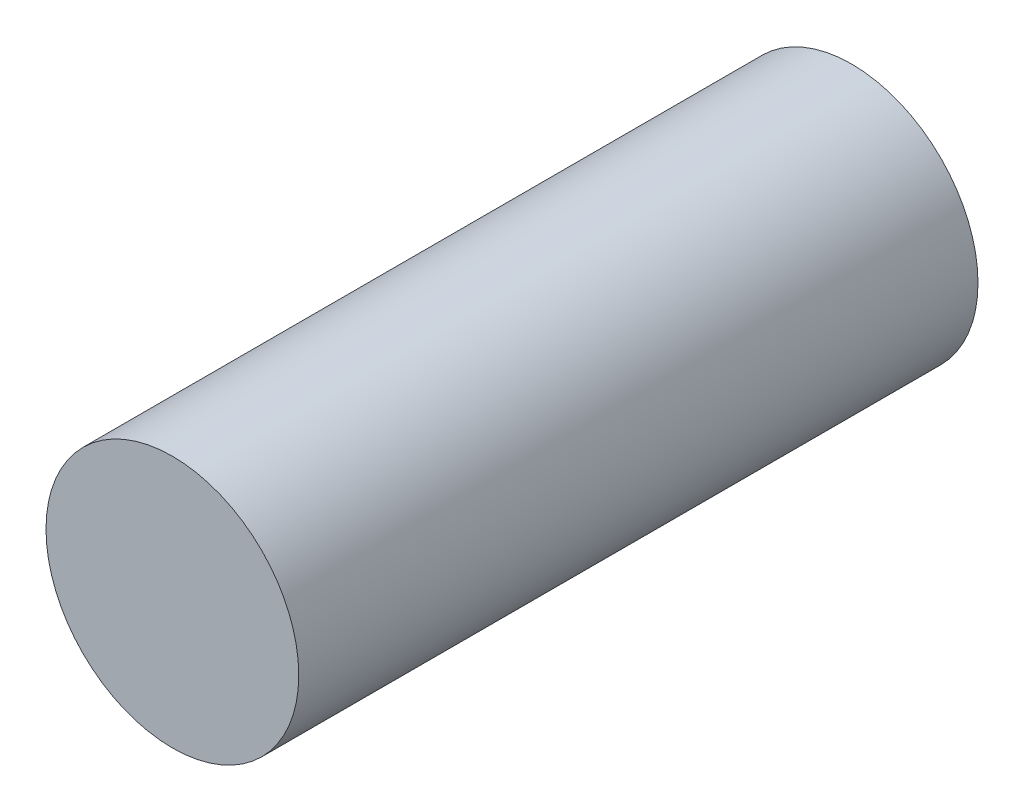
ISO-10303-21;
HEADER;
FILE_DESCRIPTION(('STEP AP214'),'2;1');
FILE_NAME('part.step','',(''),(''),'','','');
FILE_SCHEMA(('AUTOMOTIVE_DESIGN { 1 0 10303 214 1 1 1 1 }'));
ENDSEC;
DATA;
#1=APPLICATION_CONTEXT('core data for automotive mechanical design processes');
#2=APPLICATION_PROTOCOL_DEFINITION('international standard','automotive_design',2000,#1);
#3=PRODUCT_CONTEXT('',#1,'mechanical');
#4=PRODUCT('Part','Part','',(#3));
#5=PRODUCT_RELATED_PRODUCT_CATEGORY('part','',(#4));
#6=PRODUCT_DEFINITION_FORMATION('','',#4);
#7=PRODUCT_DEFINITION_CONTEXT('part definition',#1,'design');
#8=PRODUCT_DEFINITION('design','',#6,#7);
#9=PRODUCT_DEFINITION_SHAPE('','',#8);
#10=(LENGTH_UNIT() NAMED_UNIT(*) SI_UNIT(.MILLI.,.METRE.));
#11=(NAMED_UNIT(*) PLANE_ANGLE_UNIT() SI_UNIT($,.RADIAN.));
#12=(NAMED_UNIT(*) SI_UNIT($,.STERADIAN.) SOLID_ANGLE_UNIT());
#13=UNCERTAINTY_MEASURE_WITH_UNIT(LENGTH_MEASURE(1.E-05),#10,'distance_accuracy_value','');
#14=(GEOMETRIC_REPRESENTATION_CONTEXT(3) GLOBAL_UNCERTAINTY_ASSIGNED_CONTEXT((#13)) GLOBAL_UNIT_ASSIGNED_CONTEXT((#10,
#11,#12)) REPRESENTATION_CONTEXT('',''));
#15=CARTESIAN_POINT('',(0.,0.,0.));
#16=DIRECTION('',(0.,0.,1.));
#17=DIRECTION('',(1.,0.,0.));
#18=AXIS2_PLACEMENT_3D('',#15,#16,#17);
#19=CARTESIAN_POINT('',(0.,0.,21.5));
#20=DIRECTION('',(0.,0.,-1.));
#21=DIRECTION('',(-1.,0.,0.));
#22=AXIS2_PLACEMENT_3D('',#19,#20,#21);
#23=CYLINDRICAL_SURFACE('',#22,4.);
#24=CARTESIAN_POINT('',(0.,0.,0.));
#25=DIRECTION('',(0.,0.,1.));
#26=DIRECTION('',(1.,0.,0.));
#27=AXIS2_PLACEMENT_3D('',#24,#25,#26);
#28=CIRCLE('',#27,4.);
#29=CARTESIAN_POINT('',(4.,0.,0.));
#30=VERTEX_POINT('',#29);
#31=EDGE_CURVE('E203',#30,#30,#28,.T.);
#32=ORIENTED_EDGE('',*,*,#31,.T.);
#33=EDGE_LOOP('',(#32));
#34=FACE_BOUND('',#33,.T.);
#35=CARTESIAN_POINT('',(0.,0.,21.5));
#36=DIRECTION('',(0.,0.,1.));
#37=DIRECTION('',(1.,0.,0.));
#38=AXIS2_PLACEMENT_3D('',#35,#36,#37);
#39=CIRCLE('',#38,4.);
#40=CARTESIAN_POINT('',(4.,0.,21.5));
#41=VERTEX_POINT('',#40);
#42=EDGE_CURVE('E196',#41,#41,#39,.T.);
#43=ORIENTED_EDGE('',*,*,#42,.F.);
#44=EDGE_LOOP('',(#43));
#45=FACE_BOUND('',#44,.T.);
#46=CARTESIAN_POINT('',(0.,0.,3.5));
#47=DIRECTION('',(0.,0.,1.));
#48=DIRECTION('',(1.,0.,0.));
#49=AXIS2_PLACEMENT_3D('',#46,#47,#48);
#50=CIRCLE('',#49,4.);
#51=CARTESIAN_POINT('',(-3.99801948525833,0.125857838431891,3.5));
#52=VERTEX_POINT('',#51);
#53=CARTESIAN_POINT('',(-3.99801948525833,-0.125857838431891,3.5));
#54=VERTEX_POINT('',#53);
#55=EDGE_CURVE('E129',#52,#54,#50,.T.);
#56=ORIENTED_EDGE('',*,*,#55,.F.);
#57=CARTESIAN_POINT('',(-3.99801948525833,0.125857838431891,3.5));
#58=CARTESIAN_POINT('',(-3.99673263246779,0.166844856586794,3.49999874158195));
#59=CARTESIAN_POINT('',(-3.99480861869546,0.207790115634007,3.50168097928404));
#60=CARTESIAN_POINT('',(-3.98973164248578,0.289318343646819,3.50837213454654));
#61=CARTESIAN_POINT('',(-3.98657907122101,0.329901423727223,3.51337999358643));
#62=CARTESIAN_POINT('',(-3.97537675181758,0.450383770823694,3.53327623561093));
#63=CARTESIAN_POINT('',(-3.96557057131099,0.529371576192779,3.55303807402179));
#64=CARTESIAN_POINT('',(-3.94210773853126,0.68249628855339,3.60476070868729));
#65=CARTESIAN_POINT('',(-3.92845400626856,0.756636821901756,3.63671226032286));
#66=CARTESIAN_POINT('',(-3.89845839343059,0.898489251650175,3.71179018846561));
#67=CARTESIAN_POINT('',(-3.88211445800014,0.966196171025945,3.75492512176249));
#68=CARTESIAN_POINT('',(-3.84741144773351,1.09643266506494,3.85329614179824));
#69=CARTESIAN_POINT('',(-3.82899591607049,1.1586139581345,3.90897317671936));
#70=CARTESIAN_POINT('',(-3.79250952601473,1.27298115639352,4.02992866007465));
#71=CARTESIAN_POINT('',(-3.77443880534722,1.32516313989097,4.09521085794547));
#72=CARTESIAN_POINT('',(-3.73986941166915,1.41986429851514,4.23643505209315));
#73=CARTESIAN_POINT('',(-3.72345042036058,1.46196953427901,4.31267550606613));
#74=CARTESIAN_POINT('',(-3.69497435630068,1.5325210405181,4.47192911967735));
#75=CARTESIAN_POINT('',(-3.68291082213723,1.56098756499733,4.55493202098631));
#76=CARTESIAN_POINT('',(-3.66761484865019,1.59651410051497,4.69864230557345));
#77=CARTESIAN_POINT('',(-3.66280209029415,1.60748002729163,4.75824112310019));
#78=CARTESIAN_POINT('',(-3.65630861273086,1.62216676988515,4.87854230834086));
#79=CARTESIAN_POINT('',(-3.65463065564836,1.6258811964158,4.93924560172625));
#80=CARTESIAN_POINT('',(-3.65466637180599,1.62585783843189,5.));
#81=B_SPLINE_CURVE_WITH_KNOTS('',3,(#57,#58,#59,#60,#61,#62,#63,#64,#65,#66,#67,#68,#69,#70,#71,
#72,#73,#74,#75,#76,#77,#78,#79,#80),.UNSPECIFIED.,.F.,.F.,(4,2,2,2,2,2,2,2,2,2,2,4),(0.,
0.122940340296385,0.245841568340701,0.490591484052095,0.735156150425775,0.979908496723475,
1.2351955524967,1.49058252689656,1.75513392974146,2.01929123654609,2.20116658357156,
2.38320210850173),.UNSPECIFIED.);
#82=CARTESIAN_POINT('',(-3.65466637180599,1.62585783843189,5.));
#83=VERTEX_POINT('',#82);
#84=EDGE_CURVE('E115',#52,#83,#81,.T.);
#85=ORIENTED_EDGE('',*,*,#84,.T.);
#86=DIRECTION('',(0.,0.,-1.));
#87=VECTOR('',#86,1.);
#88=CARTESIAN_POINT('',(-3.65466637180599,1.62585783843189,21.5));
#89=LINE('',#88,#87);
#90=CARTESIAN_POINT('',(-3.65466637180599,1.62585783843189,17.));
#91=VERTEX_POINT('',#90);
#92=EDGE_CURVE('E136',#83,#91,#89,.F.);
#93=ORIENTED_EDGE('',*,*,#92,.T.);
#94=CARTESIAN_POINT('',(-3.65466637180599,1.62585783843189,17.));
#95=CARTESIAN_POINT('',(-3.65466132159849,1.62585962645453,17.0402553916515));
#96=CARTESIAN_POINT('',(-3.65538816248137,1.6242362834614,17.0804895296114));
#97=CARTESIAN_POINT('',(-3.65825466306148,1.61777368375385,17.1606329644286));
#98=CARTESIAN_POINT('',(-3.66039378487607,1.61293565138449,17.2005423791044));
#99=CARTESIAN_POINT('',(-3.66882631261045,1.59371234810209,17.3190168336295));
#100=CARTESIAN_POINT('',(-3.67713589290591,1.57461707203841,17.3967289920046));
#101=CARTESIAN_POINT('',(-3.69813393583026,1.52464009355371,17.5474677287338));
#102=CARTESIAN_POINT('',(-3.710817902965,1.49377048800311,17.6204990265234));
#103=CARTESIAN_POINT('',(-3.73920107805232,1.42122816989718,17.760415079444));
#104=CARTESIAN_POINT('',(-3.75490323330357,1.37954488361909,17.8272937312656));
#105=CARTESIAN_POINT('',(-3.78865976349797,1.28403604081626,17.9567810668551));
#106=CARTESIAN_POINT('',(-3.80679409676606,1.22969069311964,18.0189852814727));
#107=CARTESIAN_POINT('',(-3.84295930900446,1.11152114224106,18.1336888240056));
#108=CARTESIAN_POINT('',(-3.8609901571845,1.04769425588224,18.1861853952879));
#109=CARTESIAN_POINT('',(-3.89609029606495,0.90875992308956,18.2823934372229));
#110=CARTESIAN_POINT('',(-3.91307470008444,0.833263555866128,18.3255767491561));
#111=CARTESIAN_POINT('',(-3.94338881560745,0.675371940831859,18.3984189549824));
#112=CARTESIAN_POINT('',(-3.95672253126641,0.592984382016854,18.4280926903563));
#113=CARTESIAN_POINT('',(-3.97551479468959,0.446309375849039,18.4667758633965));
#114=CARTESIAN_POINT('',(-3.98212502867155,0.38304773540554,18.4791844907638));
#115=CARTESIAN_POINT('',(-3.99237602725836,0.255178722432629,18.4958128957836));
#116=CARTESIAN_POINT('',(-3.99601464868317,0.190570413040109,18.5000267662511));
#117=CARTESIAN_POINT('',(-3.99801948525833,0.125857838431891,18.5));
#118=B_SPLINE_CURVE_WITH_KNOTS('',3,(#94,#95,#96,#97,#98,#99,#100,#101,#102,#103,#104,#105,#106,
#107,#108,#109,#110,#111,#112,#113,#114,#115,#116,#117),.UNSPECIFIED.,.F.,.F.,(4,2,2,2,2,2,2,2,
2,2,2,4),(0.,0.120685770305709,0.241325602612527,0.481418988869123,0.721266366272314,
0.961349158592582,1.21395025369061,1.46662296893047,1.73115829823019,1.99540230630437,
2.18924436418444,2.3832261012647),.UNSPECIFIED.);
#119=CARTESIAN_POINT('',(-3.99801948525833,0.125857838431891,18.5));
#120=VERTEX_POINT('',#119);
#121=EDGE_CURVE('E54',#91,#120,#118,.T.);
#122=ORIENTED_EDGE('',*,*,#121,.T.);
#123=CARTESIAN_POINT('',(0.,0.,18.5));
#124=DIRECTION('',(0.,0.,1.));
#125=DIRECTION('',(1.,0.,0.));
#126=AXIS2_PLACEMENT_3D('',#123,#124,#125);
#127=CIRCLE('',#126,4.);
#128=CARTESIAN_POINT('',(-3.99801948525833,-0.125857838431891,18.5));
#129=VERTEX_POINT('',#128);
#130=EDGE_CURVE('E197',#120,#129,#127,.T.);
#131=ORIENTED_EDGE('',*,*,#130,.T.);
#132=CARTESIAN_POINT('',(-3.99801948525833,-0.125857838431891,18.5));
#133=CARTESIAN_POINT('',(-3.99673263246779,-0.166844856586793,18.500001258418));
#134=CARTESIAN_POINT('',(-3.99480861869546,-0.207790115634007,18.498319020716));
#135=CARTESIAN_POINT('',(-3.98973164248578,-0.289318343646818,18.4916278654535));
#136=CARTESIAN_POINT('',(-3.98657907122101,-0.329901423727222,18.4866200064136));
#137=CARTESIAN_POINT('',(-3.97537675181758,-0.450383770823693,18.4667237643891));
#138=CARTESIAN_POINT('',(-3.96557057131099,-0.529371576192779,18.4469619259782));
#139=CARTESIAN_POINT('',(-3.94210773853126,-0.682496288553389,18.3952392913127));
#140=CARTESIAN_POINT('',(-3.92845400626856,-0.756636821901754,18.3632877396771));
#141=CARTESIAN_POINT('',(-3.89845839343059,-0.898489251650173,18.2882098115344));
#142=CARTESIAN_POINT('',(-3.88211445800014,-0.966196171025943,18.2450748782375));
#143=CARTESIAN_POINT('',(-3.84741144773351,-1.09643266506494,18.1467038582018));
#144=CARTESIAN_POINT('',(-3.8289959160705,-1.1586139581345,18.0910268232806));
#145=CARTESIAN_POINT('',(-3.79250952601473,-1.27298115639352,17.9700713399254));
#146=CARTESIAN_POINT('',(-3.77443880534722,-1.32516313989097,17.9047891420545));
#147=CARTESIAN_POINT('',(-3.73986941166915,-1.41986429851514,17.7635649479069));
#148=CARTESIAN_POINT('',(-3.72345042036058,-1.46196953427901,17.6873244939339));
#149=CARTESIAN_POINT('',(-3.69497435630068,-1.5325210405181,17.5280708803226));
#150=CARTESIAN_POINT('',(-3.68291082213723,-1.56098756499733,17.4450679790137));
#151=CARTESIAN_POINT('',(-3.66761484865019,-1.59651410051497,17.3013576944265));
#152=CARTESIAN_POINT('',(-3.66280209029415,-1.60748002729163,17.2417588768998));
#153=CARTESIAN_POINT('',(-3.65630861273086,-1.62216676988515,17.1214576916591));
#154=CARTESIAN_POINT('',(-3.65463065564836,-1.6258811964158,17.0607543982737));
#155=CARTESIAN_POINT('',(-3.65466637180599,-1.62585783843189,17.));
#156=B_SPLINE_CURVE_WITH_KNOTS('',3,(#132,#133,#134,#135,#136,#137,#138,#139,#140,#141,#142,
#143,#144,#145,#146,#147,#148,#149,#150,#151,#152,#153,#154,#155),.UNSPECIFIED.,.F.,.F.,(4,2,2,
2,2,2,2,2,2,2,2,4),(0.,0.122940340296385,0.245841568340701,0.490591484052095,0.735156150425773,
0.979908496723473,1.2351955524967,1.49058252689655,1.75513392974146,2.01929123654609,
2.20116658357157,2.38320210850173),.UNSPECIFIED.);
#157=CARTESIAN_POINT('',(-3.65466637180599,-1.62585783843189,17.));
#158=VERTEX_POINT('',#157);
#159=EDGE_CURVE('E11',#129,#158,#156,.T.);
#160=ORIENTED_EDGE('',*,*,#159,.T.);
#161=DIRECTION('',(0.,0.,-1.));
#162=VECTOR('',#161,1.);
#163=CARTESIAN_POINT('',(-3.65466637180599,-1.62585783843189,21.5));
#164=LINE('',#163,#162);
#165=CARTESIAN_POINT('',(-3.65466637180599,-1.62585783843189,5.));
#166=VERTEX_POINT('',#165);
#167=EDGE_CURVE('E138',#158,#166,#164,.T.);
#168=ORIENTED_EDGE('',*,*,#167,.T.);
#169=CARTESIAN_POINT('',(-3.65466637180599,-1.62585783843189,5.));
#170=CARTESIAN_POINT('',(-3.65466132159849,-1.62585962645453,4.95974460834846));
#171=CARTESIAN_POINT('',(-3.65538816248137,-1.6242362834614,4.91951047038857));
#172=CARTESIAN_POINT('',(-3.65825466306148,-1.61777368375385,4.83936703557138));
#173=CARTESIAN_POINT('',(-3.66039378487607,-1.61293565138449,4.79945762089555));
#174=CARTESIAN_POINT('',(-3.66882631261045,-1.59371234810209,4.68098316637052));
#175=CARTESIAN_POINT('',(-3.67713589290591,-1.57461707203841,4.60327100799537));
#176=CARTESIAN_POINT('',(-3.69813393583026,-1.52464009355371,4.45253227126616));
#177=CARTESIAN_POINT('',(-3.710817902965,-1.49377048800311,4.37950097347657));
#178=CARTESIAN_POINT('',(-3.73920107805232,-1.42122816989718,4.23958492055598));
#179=CARTESIAN_POINT('',(-3.75490323330357,-1.37954488361909,4.1727062687344));
#180=CARTESIAN_POINT('',(-3.78865976349797,-1.28403604081626,4.04321893314489));
#181=CARTESIAN_POINT('',(-3.80679409676606,-1.22969069311964,3.9810147185273));
#182=CARTESIAN_POINT('',(-3.84295930900446,-1.11152114224106,3.86631117599441));
#183=CARTESIAN_POINT('',(-3.8609901571845,-1.04769425588224,3.81381460471209));
#184=CARTESIAN_POINT('',(-3.89609029606495,-0.908759923089559,3.71760656277707));
#185=CARTESIAN_POINT('',(-3.91307470008444,-0.833263555866127,3.67442325084387));
#186=CARTESIAN_POINT('',(-3.94338881560745,-0.675371940831858,3.60158104501757));
#187=CARTESIAN_POINT('',(-3.95672253126641,-0.592984382016852,3.57190730964374));
#188=CARTESIAN_POINT('',(-3.97551479468959,-0.446309375849037,3.53322413660347));
#189=CARTESIAN_POINT('',(-3.98212502867155,-0.383047735405539,3.52081550923622));
#190=CARTESIAN_POINT('',(-3.99237602725836,-0.255178722432628,3.50418710421639));
#191=CARTESIAN_POINT('',(-3.99601464868317,-0.190570413040109,3.49997323374889));
#192=CARTESIAN_POINT('',(-3.99801948525833,-0.125857838431891,3.5));
#193=B_SPLINE_CURVE_WITH_KNOTS('',3,(#169,#170,#171,#172,#173,#174,#175,#176,#177,#178,#179,
#180,#181,#182,#183,#184,#185,#186,#187,#188,#189,#190,#191,#192),.UNSPECIFIED.,.F.,.F.,(4,2,2,
2,2,2,2,2,2,2,2,4),(0.,0.120685770305705,0.241325602612527,0.481418988869124,0.721266366272311,
0.961349158592583,1.21395025369061,1.46662296893047,1.73115829823019,1.99540230630437,
2.18924436418444,2.3832261012647),.UNSPECIFIED.);
#194=EDGE_CURVE('E125',#166,#54,#193,.T.);
#195=ORIENTED_EDGE('',*,*,#194,.T.);
#196=EDGE_LOOP('',(#56,#85,#93,#122,#131,#160,#168,#195));
#197=FACE_BOUND('',#196,.T.);
#198=ADVANCED_FACE('F41',(#34,#45,#197),#23,.T.);
#199=CARTESIAN_POINT('',(0.,0.,21.5));
#200=DIRECTION('',(0.,0.,1.));
#201=DIRECTION('',(1.,0.,0.));
#202=AXIS2_PLACEMENT_3D('',#199,#200,#201);
#203=PLANE('',#202);
#204=ORIENTED_EDGE('',*,*,#42,.T.);
#205=EDGE_LOOP('',(#204));
#206=FACE_BOUND('',#205,.T.);
#207=ADVANCED_FACE('F233',(#206),#203,.T.);
#208=CARTESIAN_POINT('',(0.,0.,0.));
#209=DIRECTION('',(0.,0.,1.));
#210=DIRECTION('',(1.,0.,0.));
#211=AXIS2_PLACEMENT_3D('',#208,#209,#210);
#212=PLANE('',#211);
#213=ORIENTED_EDGE('',*,*,#31,.F.);
#214=EDGE_LOOP('',(#213));
#215=FACE_BOUND('',#214,.T.);
#216=ADVANCED_FACE('F224',(#215),#212,.F.);
#217=CARTESIAN_POINT('',(-5.25000004,-1.62585783843189,3.5));
#218=DIRECTION('',(0.,-1.,0.));
#219=DIRECTION('',(0.,0.,-1.));
#220=AXIS2_PLACEMENT_3D('',#217,#218,#219);
#221=PLANE('',#220);
#222=ORIENTED_EDGE('',*,*,#167,.F.);
#223=DIRECTION('',(1.,0.,0.));
#224=VECTOR('',#223,1.);
#225=CARTESIAN_POINT('',(-2.74999996,-1.62585783843189,17.));
#226=LINE('',#225,#224);
#227=CARTESIAN_POINT('',(-2.74999996,-1.62585783843189,17.));
#228=VERTEX_POINT('',#227);
#229=EDGE_CURVE('E179',#158,#228,#226,.T.);
#230=ORIENTED_EDGE('',*,*,#229,.T.);
#231=DIRECTION('',(0.,0.,1.));
#232=VECTOR('',#231,1.);
#233=CARTESIAN_POINT('',(-2.74999996,-1.62585783843189,3.5));
#234=LINE('',#233,#232);
#235=CARTESIAN_POINT('',(-2.74999996,-1.62585783843189,5.));
#236=VERTEX_POINT('',#235);
#237=EDGE_CURVE('E204',#236,#228,#234,.T.);
#238=ORIENTED_EDGE('',*,*,#237,.F.);
#239=DIRECTION('',(1.,0.,0.));
#240=VECTOR('',#239,1.);
#241=CARTESIAN_POINT('',(-5.25000004,-1.62585783843189,5.));
#242=LINE('',#241,#240);
#243=EDGE_CURVE('E150',#236,#166,#242,.F.);
#244=ORIENTED_EDGE('',*,*,#243,.T.);
#245=EDGE_LOOP('',(#222,#230,#238,#244));
#246=FACE_BOUND('',#245,.T.);
#247=ADVANCED_FACE('F219',(#246),#221,.F.);
#248=CARTESIAN_POINT('',(-5.25000004,1.62585783843189,3.5));
#249=DIRECTION('',(0.,1.,0.));
#250=DIRECTION('',(0.,0.,1.));
#251=AXIS2_PLACEMENT_3D('',#248,#249,#250);
#252=PLANE('',#251);
#253=DIRECTION('',(0.,0.,1.));
#254=VECTOR('',#253,1.);
#255=CARTESIAN_POINT('',(-2.74999996,1.62585783843189,3.5));
#256=LINE('',#255,#254);
#257=CARTESIAN_POINT('',(-2.74999996,1.62585783843189,5.));
#258=VERTEX_POINT('',#257);
#259=CARTESIAN_POINT('',(-2.74999996,1.62585783843189,17.));
#260=VERTEX_POINT('',#259);
#261=EDGE_CURVE('E192',#258,#260,#256,.T.);
#262=ORIENTED_EDGE('',*,*,#261,.T.);
#263=DIRECTION('',(-1.,0.,0.));
#264=VECTOR('',#263,1.);
#265=CARTESIAN_POINT('',(-3.65466637180599,1.62585783843189,17.));
#266=LINE('',#265,#264);
#267=EDGE_CURVE('E123',#260,#91,#266,.T.);
#268=ORIENTED_EDGE('',*,*,#267,.T.);
#269=ORIENTED_EDGE('',*,*,#92,.F.);
#270=DIRECTION('',(-1.,0.,0.));
#271=VECTOR('',#270,1.);
#272=CARTESIAN_POINT('',(-5.25000004,1.62585783843189,5.));
#273=LINE('',#272,#271);
#274=EDGE_CURVE('E117',#83,#258,#273,.F.);
#275=ORIENTED_EDGE('',*,*,#274,.T.);
#276=EDGE_LOOP('',(#262,#268,#269,#275));
#277=FACE_BOUND('',#276,.T.);
#278=ADVANCED_FACE('F195',(#277),#252,.F.);
#279=CARTESIAN_POINT('',(0.,0.,3.5));
#280=DIRECTION('',(0.,0.,1.));
#281=DIRECTION('',(1.,0.,0.));
#282=AXIS2_PLACEMENT_3D('',#279,#280,#281);
#283=PLANE('',#282);
#284=ORIENTED_EDGE('',*,*,#55,.T.);
#285=DIRECTION('',(1.,0.,0.));
#286=VECTOR('',#285,1.);
#287=CARTESIAN_POINT('',(0.,-0.125857838431891,3.5));
#288=LINE('',#287,#286);
#289=CARTESIAN_POINT('',(-2.74999996,-0.12585783843189,3.5));
#290=VERTEX_POINT('',#289);
#291=EDGE_CURVE('E134',#54,#290,#288,.T.);
#292=ORIENTED_EDGE('',*,*,#291,.T.);
#293=DIRECTION('',(0.,1.,0.));
#294=VECTOR('',#293,1.);
#295=CARTESIAN_POINT('',(-2.74999996,1.62585783843189,3.5));
#296=LINE('',#295,#294);
#297=CARTESIAN_POINT('',(-2.74999996,0.125857838431891,3.5));
#298=VERTEX_POINT('',#297);
#299=EDGE_CURVE('E132',#290,#298,#296,.T.);
#300=ORIENTED_EDGE('',*,*,#299,.T.);
#301=DIRECTION('',(-1.,0.,0.));
#302=VECTOR('',#301,1.);
#303=CARTESIAN_POINT('',(0.,0.125857838431891,3.5));
#304=LINE('',#303,#302);
#305=EDGE_CURVE('E116',#298,#52,#304,.T.);
#306=ORIENTED_EDGE('',*,*,#305,.T.);
#307=EDGE_LOOP('',(#284,#292,#300,#306));
#308=FACE_BOUND('',#307,.T.);
#309=ADVANCED_FACE('F130',(#308),#283,.T.);
#310=CARTESIAN_POINT('',(0.,0.,18.5));
#311=DIRECTION('',(0.,0.,1.));
#312=DIRECTION('',(1.,0.,0.));
#313=AXIS2_PLACEMENT_3D('',#310,#311,#312);
#314=PLANE('',#313);
#315=ORIENTED_EDGE('',*,*,#130,.F.);
#316=DIRECTION('',(-1.,0.,0.));
#317=VECTOR('',#316,1.);
#318=CARTESIAN_POINT('',(-2.74999996,0.125857838431891,18.5));
#319=LINE('',#318,#317);
#320=CARTESIAN_POINT('',(-2.74999996,0.125857838431891,18.5));
#321=VERTEX_POINT('',#320);
#322=EDGE_CURVE('E183',#120,#321,#319,.F.);
#323=ORIENTED_EDGE('',*,*,#322,.T.);
#324=DIRECTION('',(0.,1.,0.));
#325=VECTOR('',#324,1.);
#326=CARTESIAN_POINT('',(-2.74999996,1.62585783843189,18.5));
#327=LINE('',#326,#325);
#328=CARTESIAN_POINT('',(-2.74999996,-0.12585783843189,18.5));
#329=VERTEX_POINT('',#328);
#330=EDGE_CURVE('E209',#329,#321,#327,.T.);
#331=ORIENTED_EDGE('',*,*,#330,.F.);
#332=DIRECTION('',(1.,0.,0.));
#333=VECTOR('',#332,1.);
#334=CARTESIAN_POINT('',(-3.65466637180599,-0.125857838431891,18.5));
#335=LINE('',#334,#333);
#336=EDGE_CURVE('E187',#329,#129,#335,.F.);
#337=ORIENTED_EDGE('',*,*,#336,.T.);
#338=EDGE_LOOP('',(#315,#323,#331,#337));
#339=FACE_BOUND('',#338,.T.);
#340=ADVANCED_FACE('F220',(#339),#314,.F.);
#341=CARTESIAN_POINT('',(-2.74999996,1.62585783843189,3.5));
#342=DIRECTION('',(1.,0.,0.));
#343=DIRECTION('',(0.,1.,0.));
#344=AXIS2_PLACEMENT_3D('',#341,#342,#343);
#345=PLANE('',#344);
#346=ORIENTED_EDGE('',*,*,#330,.T.);
#347=CARTESIAN_POINT('',(-2.74999996,0.125857838431891,17.));
#348=DIRECTION('',(1.,0.,0.));
#349=DIRECTION('',(0.,1.,0.));
#350=AXIS2_PLACEMENT_3D('',#347,#348,#349);
#351=CIRCLE('',#350,1.5);
#352=EDGE_CURVE('E185',#321,#260,#351,.F.);
#353=ORIENTED_EDGE('',*,*,#352,.T.);
#354=ORIENTED_EDGE('',*,*,#261,.F.);
#355=CARTESIAN_POINT('',(-2.74999996,0.125857838431891,5.));
#356=DIRECTION('',(1.,0.,0.));
#357=DIRECTION('',(0.,1.,0.));
#358=AXIS2_PLACEMENT_3D('',#355,#356,#357);
#359=CIRCLE('',#358,1.5);
#360=EDGE_CURVE('E141',#258,#298,#359,.F.);
#361=ORIENTED_EDGE('',*,*,#360,.T.);
#362=ORIENTED_EDGE('',*,*,#299,.F.);
#363=CARTESIAN_POINT('',(-2.74999996,-0.125857838431891,5.));
#364=DIRECTION('',(1.,0.,0.));
#365=DIRECTION('',(0.,1.,0.));
#366=AXIS2_PLACEMENT_3D('',#363,#364,#365);
#367=CIRCLE('',#366,1.5);
#368=EDGE_CURVE('E144',#290,#236,#367,.F.);
#369=ORIENTED_EDGE('',*,*,#368,.T.);
#370=ORIENTED_EDGE('',*,*,#237,.T.);
#371=CARTESIAN_POINT('',(-2.74999996,-0.125857838431891,17.));
#372=DIRECTION('',(1.,0.,0.));
#373=DIRECTION('',(0.,1.,0.));
#374=AXIS2_PLACEMENT_3D('',#371,#372,#373);
#375=CIRCLE('',#374,1.5);
#376=EDGE_CURVE('E66',#228,#329,#375,.F.);
#377=ORIENTED_EDGE('',*,*,#376,.T.);
#378=EDGE_LOOP('',(#346,#353,#354,#361,#362,#369,#370,#377));
#379=FACE_BOUND('',#378,.T.);
#380=ADVANCED_FACE('F170',(#379),#345,.F.);
#381=CARTESIAN_POINT('',(0.,-0.125857838431891,5.));
#382=DIRECTION('',(1.,0.,0.));
#383=DIRECTION('',(0.,0.,-1.));
#384=AXIS2_PLACEMENT_3D('',#381,#382,#383);
#385=CYLINDRICAL_SURFACE('',#384,1.5);
#386=ORIENTED_EDGE('',*,*,#194,.F.);
#387=ORIENTED_EDGE('',*,*,#243,.F.);
#388=ORIENTED_EDGE('',*,*,#368,.F.);
#389=ORIENTED_EDGE('',*,*,#291,.F.);
#390=EDGE_LOOP('',(#386,#387,#388,#389));
#391=FACE_BOUND('',#390,.T.);
#392=ADVANCED_FACE('F163',(#391),#385,.F.);
#393=CARTESIAN_POINT('',(0.,0.125857838431891,5.));
#394=DIRECTION('',(-1.,0.,0.));
#395=DIRECTION('',(0.,0.,1.));
#396=AXIS2_PLACEMENT_3D('',#393,#394,#395);
#397=CYLINDRICAL_SURFACE('',#396,1.5);
#398=ORIENTED_EDGE('',*,*,#360,.F.);
#399=ORIENTED_EDGE('',*,*,#274,.F.);
#400=ORIENTED_EDGE('',*,*,#84,.F.);
#401=ORIENTED_EDGE('',*,*,#305,.F.);
#402=EDGE_LOOP('',(#398,#399,#400,#401));
#403=FACE_BOUND('',#402,.T.);
#404=ADVANCED_FACE('F113',(#403),#397,.F.);
#405=CARTESIAN_POINT('',(-5.25000004,0.125857838431891,17.));
#406=DIRECTION('',(1.,0.,0.));
#407=DIRECTION('',(0.,0.,-1.));
#408=AXIS2_PLACEMENT_3D('',#405,#406,#407);
#409=CYLINDRICAL_SURFACE('',#408,1.5);
#410=ORIENTED_EDGE('',*,*,#352,.F.);
#411=ORIENTED_EDGE('',*,*,#322,.F.);
#412=ORIENTED_EDGE('',*,*,#121,.F.);
#413=ORIENTED_EDGE('',*,*,#267,.F.);
#414=EDGE_LOOP('',(#410,#411,#412,#413));
#415=FACE_BOUND('',#414,.T.);
#416=ADVANCED_FACE('F171',(#415),#409,.F.);
#417=CARTESIAN_POINT('',(-5.25000004,-0.125857838431891,17.));
#418=DIRECTION('',(-1.,0.,0.));
#419=DIRECTION('',(0.,0.,1.));
#420=AXIS2_PLACEMENT_3D('',#417,#418,#419);
#421=CYLINDRICAL_SURFACE('',#420,1.5);
#422=ORIENTED_EDGE('',*,*,#159,.F.);
#423=ORIENTED_EDGE('',*,*,#336,.F.);
#424=ORIENTED_EDGE('',*,*,#376,.F.);
#425=ORIENTED_EDGE('',*,*,#229,.F.);
#426=EDGE_LOOP('',(#422,#423,#424,#425));
#427=FACE_BOUND('',#426,.T.);
#428=ADVANCED_FACE('F43',(#427),#421,.F.);
#429=CLOSED_SHELL('',(#198,#207,#216,#247,#278,#309,#340,#380,#392,#404,#416,#428));
#430=MANIFOLD_SOLID_BREP('B2',#429);
#431=ADVANCED_BREP_SHAPE_REPRESENTATION('',(#18,#430),#14);
#432=SHAPE_DEFINITION_REPRESENTATION(#9,#431);
ENDSEC;
END-ISO-10303-21;
